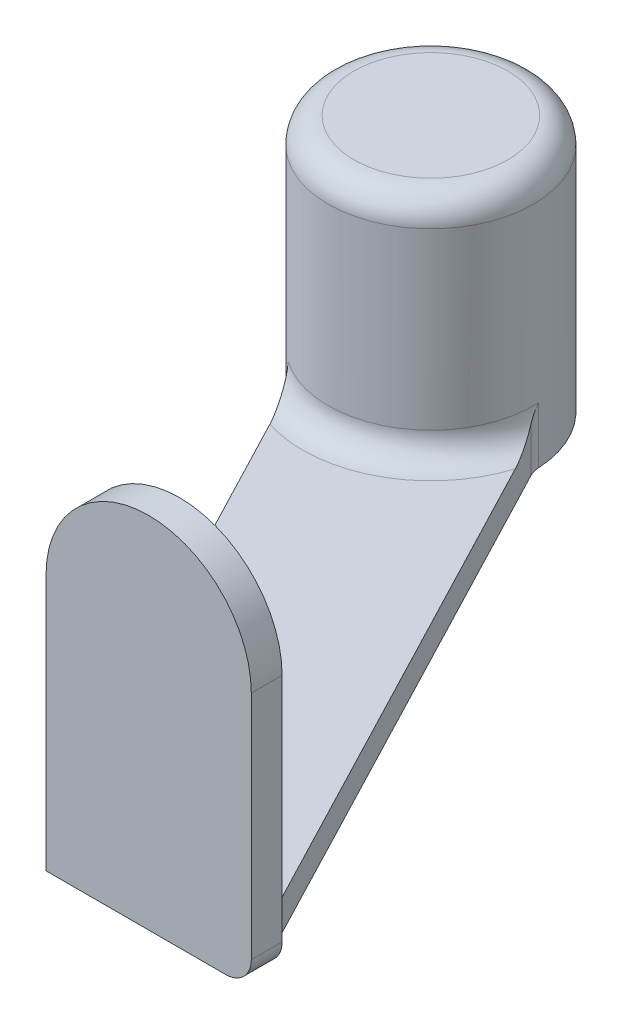
ISO-10303-21;
HEADER;
FILE_DESCRIPTION(('STEP AP214'),'2;1');
FILE_NAME('part.step','',(''),(''),'','','');
FILE_SCHEMA(('AUTOMOTIVE_DESIGN { 1 0 10303 214 1 1 1 1 }'));
ENDSEC;
DATA;
#1=APPLICATION_CONTEXT('core data for automotive mechanical design processes');
#2=APPLICATION_PROTOCOL_DEFINITION('international standard','automotive_design',2000,#1);
#3=PRODUCT_CONTEXT('',#1,'mechanical');
#4=PRODUCT('Part','Part','',(#3));
#5=PRODUCT_RELATED_PRODUCT_CATEGORY('part','',(#4));
#6=PRODUCT_DEFINITION_FORMATION('','',#4);
#7=PRODUCT_DEFINITION_CONTEXT('part definition',#1,'design');
#8=PRODUCT_DEFINITION('design','',#6,#7);
#9=PRODUCT_DEFINITION_SHAPE('','',#8);
#10=(LENGTH_UNIT() NAMED_UNIT(*) SI_UNIT(.MILLI.,.METRE.));
#11=(NAMED_UNIT(*) PLANE_ANGLE_UNIT() SI_UNIT($,.RADIAN.));
#12=(NAMED_UNIT(*) SI_UNIT($,.STERADIAN.) SOLID_ANGLE_UNIT());
#13=UNCERTAINTY_MEASURE_WITH_UNIT(LENGTH_MEASURE(1.E-05),#10,'distance_accuracy_value','');
#14=(GEOMETRIC_REPRESENTATION_CONTEXT(3) GLOBAL_UNCERTAINTY_ASSIGNED_CONTEXT((#13)) GLOBAL_UNIT_ASSIGNED_CONTEXT((#10,
#11,#12)) REPRESENTATION_CONTEXT('',''));
#15=CARTESIAN_POINT('',(0.,0.,0.));
#16=DIRECTION('',(0.,0.,1.));
#17=DIRECTION('',(1.,0.,0.));
#18=AXIS2_PLACEMENT_3D('',#15,#16,#17);
#19=CARTESIAN_POINT('',(459.323706874525,0.,110.));
#20=DIRECTION('',(0.,-1.,0.));
#21=DIRECTION('',(0.,0.,-1.));
#22=AXIS2_PLACEMENT_3D('',#19,#20,#21);
#23=PLANE('',#22);
#24=CARTESIAN_POINT('',(-59.9999999999999,0.,0.));
#25=DIRECTION('',(0.,-1.,0.));
#26=DIRECTION('',(0.,0.,-1.));
#27=AXIS2_PLACEMENT_3D('',#24,#25,#26);
#28=CIRCLE('',#27,15.);
#29=CARTESIAN_POINT('',(-59.9999999999999,0.,-15.));
#30=VERTEX_POINT('',#29);
#31=EDGE_CURVE('E187',#30,#30,#28,.F.);
#32=ORIENTED_EDGE('',*,*,#31,.T.);
#33=EDGE_LOOP('',(#32));
#34=FACE_BOUND('',#33,.T.);
#35=ADVANCED_FACE('F37',(#34),#23,.F.);
#36=CARTESIAN_POINT('',(-59.9999999999999,-5.,0.));
#37=DIRECTION('',(0.,-1.,0.));
#38=DIRECTION('',(0.,0.,-1.));
#39=AXIS2_PLACEMENT_3D('',#36,#37,#38);
#40=TOROIDAL_SURFACE('',#39,15.,5.);
#41=ORIENTED_EDGE('',*,*,#31,.F.);
#42=EDGE_LOOP('',(#41));
#43=FACE_BOUND('',#42,.T.);
#44=CARTESIAN_POINT('',(-59.9999999999999,-5.,0.));
#45=DIRECTION('',(0.,-1.,0.));
#46=DIRECTION('',(0.,0.,-1.));
#47=AXIS2_PLACEMENT_3D('',#44,#45,#46);
#48=CIRCLE('',#47,20.);
#49=CARTESIAN_POINT('',(-59.9999999999999,-5.,-20.));
#50=VERTEX_POINT('',#49);
#51=EDGE_CURVE('E184',#50,#50,#48,.T.);
#52=ORIENTED_EDGE('',*,*,#51,.F.);
#53=EDGE_LOOP('',(#52));
#54=FACE_BOUND('',#53,.T.);
#55=ADVANCED_FACE('F244',(#43,#54),#40,.T.);
#56=CARTESIAN_POINT('',(-35.0332908701864,56.5685424949237,-1.28974231041803));
#57=DIRECTION('',(0.,-1.,0.));
#58=DIRECTION('',(0.,0.,-1.));
#59=AXIS2_PLACEMENT_3D('',#56,#57,#58);
#60=CYLINDRICAL_SURFACE('',#59,5.);
#61=CARTESIAN_POINT('',(-35.0332908701864,-50.,-1.28974231041803));
#62=DIRECTION('',(0.,-1.,0.));
#63=DIRECTION('',(0.,0.,-1.));
#64=AXIS2_PLACEMENT_3D('',#61,#62,#63);
#65=CIRCLE('',#64,5.);
#66=CARTESIAN_POINT('',(-40.0266326961491,-50.,-1.03179384833445));
#67=VERTEX_POINT('',#66);
#68=CARTESIAN_POINT('',(-39.4662151010136,-50.,1.02308772305709));
#69=VERTEX_POINT('',#68);
#70=EDGE_CURVE('E11',#67,#69,#65,.F.);
#71=ORIENTED_EDGE('',*,*,#70,.F.);
#72=DIRECTION('',(0.,-1.,0.));
#73=VECTOR('',#72,1.);
#74=CARTESIAN_POINT('',(-40.0266326961491,56.5685424949237,-1.03179384833445));
#75=LINE('',#74,#73);
#76=CARTESIAN_POINT('',(-40.0266326961491,-39.,-1.03179384833445));
#77=VERTEX_POINT('',#76);
#78=EDGE_CURVE('E179',#77,#67,#75,.T.);
#79=ORIENTED_EDGE('',*,*,#78,.F.);
#80=CARTESIAN_POINT('',(-39.4662151010136,-41.2977810602773,1.02308772305708));
#81=CARTESIAN_POINT('',(-39.5095887979578,-41.2060498439024,0.939940789862016));
#82=CARTESIAN_POINT('',(-39.5502483735114,-41.1134994802737,0.856321294083508));
#83=CARTESIAN_POINT('',(-39.6263249326898,-40.927014083348,0.688276245564753));
#84=CARTESIAN_POINT('',(-39.6617427752191,-40.8330792796837,0.603850827300817));
#85=CARTESIAN_POINT('',(-39.7604166635182,-40.549577123353,0.349572690890365));
#86=CARTESIAN_POINT('',(-39.8161131697166,-40.358268911895,0.178679097171923));
#87=CARTESIAN_POINT('',(-39.9079112911607,-39.9748426216244,-0.163206415626178));
#88=CARTESIAN_POINT('',(-39.9442094631328,-39.7827533449341,-0.33417906644567));
#89=CARTESIAN_POINT('',(-39.9986951654497,-39.3972707643113,-0.677426022940305));
#90=CARTESIAN_POINT('',(-40.01689082866,-39.2038780853071,-0.849699709019501));
#91=CARTESIAN_POINT('',(-40.0263054720988,-39.0070272630662,-1.02551699609125));
#92=CARTESIAN_POINT('',(-40.0264705617197,-39.003513620113,-1.02865535611878));
#93=CARTESIAN_POINT('',(-40.0266326961491,-39.,-1.03179384833445));
#94=B_SPLINE_CURVE_WITH_KNOTS('',3,(#80,#81,#82,#83,#84,#85,#86,#87,#88,#89,#90,#91,#92,#93),
.UNSPECIFIED.,.F.,.F.,(4,2,2,2,2,2,4),(0.,0.393477765699106,0.786890985021735,1.57353344680757,
2.3520462745288,3.13020918372411,3.14435132214104),.UNSPECIFIED.);
#95=CARTESIAN_POINT('',(-39.4662151010136,-41.2977810602773,1.02308772305708));
#96=VERTEX_POINT('',#95);
#97=EDGE_CURVE('E41',#96,#77,#94,.T.);
#98=ORIENTED_EDGE('',*,*,#97,.F.);
#99=DIRECTION('',(0.,-1.,0.));
#100=VECTOR('',#99,1.);
#101=CARTESIAN_POINT('',(-39.4662151010136,-44.,1.02308772305708));
#102=LINE('',#101,#100);
#103=EDGE_CURVE('E57',#69,#96,#102,.F.);
#104=ORIENTED_EDGE('',*,*,#103,.F.);
#105=EDGE_LOOP('',(#71,#79,#98,#104));
#106=FACE_BOUND('',#105,.T.);
#107=ADVANCED_FACE('F246',(#106),#60,.F.);
#108=CARTESIAN_POINT('',(-59.9999999999999,56.5685424949237,0.));
#109=DIRECTION('',(0.,-1.,0.));
#110=DIRECTION('',(0.,0.,-1.));
#111=AXIS2_PLACEMENT_3D('',#108,#109,#110);
#112=CYLINDRICAL_SURFACE('',#111,20.);
#113=ORIENTED_EDGE('',*,*,#51,.T.);
#114=EDGE_LOOP('',(#113));
#115=FACE_BOUND('',#114,.T.);
#116=DIRECTION('',(0.,-1.,0.));
#117=VECTOR('',#116,1.);
#118=CARTESIAN_POINT('',(-71.4413075780089,56.5685424949237,16.4041604754828));
#119=LINE('',#118,#117);
#120=CARTESIAN_POINT('',(-71.4413075780089,-39.,16.4041604754827));
#121=VERTEX_POINT('',#120);
#122=CARTESIAN_POINT('',(-71.4413075780089,-50.,16.4041604754827));
#123=VERTEX_POINT('',#122);
#124=EDGE_CURVE('E263',#121,#123,#119,.T.);
#125=ORIENTED_EDGE('',*,*,#124,.F.);
#126=CARTESIAN_POINT('',(-59.9999999999999,-39.,0.));
#127=DIRECTION('',(0.,-1.,0.));
#128=DIRECTION('',(0.,0.,-1.));
#129=AXIS2_PLACEMENT_3D('',#126,#127,#128);
#130=CIRCLE('',#129,20.);
#131=EDGE_CURVE('E181',#121,#77,#130,.F.);
#132=ORIENTED_EDGE('',*,*,#131,.T.);
#133=ORIENTED_EDGE('',*,*,#78,.T.);
#134=CARTESIAN_POINT('',(-59.9999999999999,-50.,0.));
#135=DIRECTION('',(0.,-1.,0.));
#136=DIRECTION('',(0.,0.,-1.));
#137=AXIS2_PLACEMENT_3D('',#134,#135,#136);
#138=CIRCLE('',#137,20.);
#139=EDGE_CURVE('E266',#67,#123,#138,.F.);
#140=ORIENTED_EDGE('',*,*,#139,.T.);
#141=EDGE_LOOP('',(#125,#132,#133,#140));
#142=FACE_BOUND('',#141,.T.);
#143=ADVANCED_FACE('F252',(#115,#142),#112,.T.);
#144=CARTESIAN_POINT('',(-59.9999999999999,-39.,0.));
#145=DIRECTION('',(0.,-1.,0.));
#146=DIRECTION('',(0.,0.,-1.));
#147=AXIS2_PLACEMENT_3D('',#144,#145,#146);
#148=TOROIDAL_SURFACE('',#147,25.,5.);
#149=CARTESIAN_POINT('',(-67.5686326367219,-44.,23.8267874462828));
#150=CARTESIAN_POINT('',(-67.6394074778955,-43.9999957063343,23.6911356673668));
#151=CARTESIAN_POINT('',(-67.7101693269902,-43.9965102357067,23.5555087899353));
#152=CARTESIAN_POINT('',(-67.8515436503336,-43.982824454178,23.2845413368606));
#153=CARTESIAN_POINT('',(-67.9221561462281,-43.9726251943338,23.1492007197293));
#154=CARTESIAN_POINT('',(-68.1335256147483,-43.9323437636526,22.7440759050655));
#155=CARTESIAN_POINT('',(-68.2739074317342,-43.8925772846245,22.4750107558426));
#156=CARTESIAN_POINT('',(-68.5553106455663,-43.7879210311718,21.9356545959978));
#157=CARTESIAN_POINT('',(-68.6962953245598,-43.7225774758398,21.6654339612603));
#158=CARTESIAN_POINT('',(-68.9754564169969,-43.5680930803219,21.1303752007558));
#159=CARTESIAN_POINT('',(-69.1136326375733,-43.4789506116786,20.8655374446511));
#160=CARTESIAN_POINT('',(-69.389230371853,-43.2754307265991,20.3373084539483));
#161=CARTESIAN_POINT('',(-69.5265734537269,-43.1605573238025,20.0740675470233));
#162=CARTESIAN_POINT('',(-69.7965368251537,-42.9065511518861,19.5566377517886));
#163=CARTESIAN_POINT('',(-69.929153860611,-42.7674020421872,19.3024551004956));
#164=CARTESIAN_POINT('',(-70.1227614742166,-42.5402533569809,18.9313738410847));
#165=CARTESIAN_POINT('',(-70.1861743848697,-42.4618069485181,18.8098324289996));
#166=CARTESIAN_POINT('',(-70.3111591379351,-42.2983539201054,18.5702783189576));
#167=CARTESIAN_POINT('',(-70.3727313375051,-42.2133485844145,18.4522649364484));
#168=CARTESIAN_POINT('',(-70.493610904877,-42.0364882798731,18.2205790989857));
#169=CARTESIAN_POINT('',(-70.5529213890247,-41.9446432918659,18.1069006710358));
#170=CARTESIAN_POINT('',(-70.6688845897273,-41.7534689176981,17.8846378696892));
#171=CARTESIAN_POINT('',(-70.7255383875241,-41.6541426200054,17.7760514239121));
#172=CARTESIAN_POINT('',(-70.815884657388,-41.4842387426586,17.6028877400062));
#173=CARTESIAN_POINT('',(-70.8505469487247,-41.4160735492951,17.5364516816109));
#174=CARTESIAN_POINT('',(-70.9182607645014,-41.2761394628668,17.4066668680389));
#175=CARTESIAN_POINT('',(-70.9513124312852,-41.2043708894038,17.3433178400366));
#176=CARTESIAN_POINT('',(-71.0477904315063,-40.9829344105169,17.1584016729462));
#177=CARTESIAN_POINT('',(-71.1084315459832,-40.8273346582699,17.0421728701987));
#178=CARTESIAN_POINT('',(-71.1916243947202,-40.579659173285,16.8827199101195));
#179=CARTESIAN_POINT('',(-71.2182517164447,-40.4939338923417,16.8316842101474));
#180=CARTESIAN_POINT('',(-71.2680608050631,-40.3178447272519,16.7362167902956));
#181=CARTESIAN_POINT('',(-71.2912418712319,-40.2274799047617,16.6917864134721));
#182=CARTESIAN_POINT('',(-71.3332944971637,-40.0427996459699,16.6111855471027));
#183=CARTESIAN_POINT('',(-71.3521907413328,-39.9485107450309,16.5749677457786));
#184=CARTESIAN_POINT('',(-71.3850434119212,-39.7560545471287,16.512000127151));
#185=CARTESIAN_POINT('',(-71.3990050377481,-39.657891454252,16.4852403443161));
#186=CARTESIAN_POINT('',(-71.4203066358278,-39.4671819630536,16.44441228133));
#187=CARTESIAN_POINT('',(-71.4281149729534,-39.3748843533696,16.4294463018391));
#188=CARTESIAN_POINT('',(-71.4359954991483,-39.2351853626568,16.4143419599656));
#189=CARTESIAN_POINT('',(-71.4379838272847,-39.1882630761937,16.4105309977042));
#190=CARTESIAN_POINT('',(-71.4406411161503,-39.0942310759437,16.4054378607118));
#191=CARTESIAN_POINT('',(-71.4413096982431,-39.0471213122526,16.4041564117005));
#192=CARTESIAN_POINT('',(-71.4413075780089,-39.,16.4041604754827));
#193=B_SPLINE_CURVE_WITH_KNOTS('',3,(#149,#150,#151,#152,#153,#154,#155,#156,#157,#158,#159,
#160,#161,#162,#163,#164,#165,#166,#167,#168,#169,#170,#171,#172,#173,#174,#175,#176,#177,#178,
#179,#180,#181,#182,#183,#184,#185,#186,#187,#188,#189,#190,#191,#192),.UNSPECIFIED.,.F.,.F.,(4,
2,2,2,2,2,2,2,2,2,2,2,2,2,2,2,2,2,2,2,2,4),(0.,0.45892521038416,0.917778592209801,
1.83488510432387,2.7690593095204,3.70329745263651,4.65738803065461,5.61212332618994,
6.08581743172794,6.55941902067393,7.03234255539925,7.50507191463021,7.80885051623837,
8.11260222162986,8.72102310469405,9.03051451975441,9.3400687777034,9.64779166037518,
9.95518933446293,10.2359930014452,10.3772721398365,10.5185918054554),.UNSPECIFIED.);
#194=CARTESIAN_POINT('',(-67.568632636722,-44.,23.8267874462828));
#195=VERTEX_POINT('',#194);
#196=EDGE_CURVE('E204',#195,#121,#193,.T.);
#197=ORIENTED_EDGE('',*,*,#196,.F.);
#198=CARTESIAN_POINT('',(-59.9999999999999,-44.,0.));
#199=DIRECTION('',(0.,-1.,0.));
#200=DIRECTION('',(0.,0.,-1.));
#201=AXIS2_PLACEMENT_3D('',#198,#199,#200);
#202=CIRCLE('',#201,25.);
#203=CARTESIAN_POINT('',(-36.127325058713,-44.,7.42262697079996));
#204=VERTEX_POINT('',#203);
#205=EDGE_CURVE('E192',#204,#195,#202,.T.);
#206=ORIENTED_EDGE('',*,*,#205,.F.);
#207=CARTESIAN_POINT('',(-39.4662151010136,-41.2977810602773,1.02308772305708));
#208=CARTESIAN_POINT('',(-39.4310801206479,-41.372047631136,1.09042976875813));
#209=CARTESIAN_POINT('',(-39.3950520785148,-41.4442990005166,1.15948351617978));
#210=CARTESIAN_POINT('',(-39.321460439985,-41.5849808420244,1.30053415669527));
#211=CARTESIAN_POINT('',(-39.2838975497158,-41.653413037682,1.37252969637799));
#212=CARTESIAN_POINT('',(-39.2075308884322,-41.7865997555289,1.51889913050492));
#213=CARTESIAN_POINT('',(-39.1687297515882,-41.8513613646148,1.59326797612248));
#214=CARTESIAN_POINT('',(-39.0899820663682,-41.977555076726,1.74420103946081));
#215=CARTESIAN_POINT('',(-39.0500353645158,-42.0389867304058,1.82076555134465));
#216=CARTESIAN_POINT('',(-38.9287171024863,-42.2185094382373,2.05329222023455));
#217=CARTESIAN_POINT('',(-38.845839620667,-42.331876026524,2.21214072705488));
#218=CARTESIAN_POINT('',(-38.6768732319592,-42.5470105977814,2.53599297207815));
#219=CARTESIAN_POINT('',(-38.5907818850232,-42.6487695200325,2.70100138703878));
#220=CARTESIAN_POINT('',(-38.3684602004422,-42.8935800018219,3.1271179491523));
#221=CARTESIAN_POINT('',(-38.2304192447908,-43.029000623418,3.39169644748425));
#222=CARTESIAN_POINT('',(-37.9495801235375,-43.2744207909353,3.92997142988627));
#223=CARTESIAN_POINT('',(-37.8067806959316,-43.3844135306858,4.20367033279759));
#224=CARTESIAN_POINT('',(-37.5173686973729,-43.5787682633448,4.75837666336856));
#225=CARTESIAN_POINT('',(-37.3707531810977,-43.6631097805981,5.03938973622928));
#226=CARTESIAN_POINT('',(-37.0748398287865,-43.8049111534692,5.60655699482584));
#227=CARTESIAN_POINT('',(-36.9255437302597,-43.8623878125707,5.89270785033543));
#228=CARTESIAN_POINT('',(-36.6678092438755,-43.9365322706474,6.38669894923848));
#229=CARTESIAN_POINT('',(-36.5597933475178,-43.9601510504176,6.5937294172575));
#230=CARTESIAN_POINT('',(-36.343637933063,-43.9918477988025,7.00802729496247));
#231=CARTESIAN_POINT('',(-36.2355000074283,-43.9999769458228,7.21529165242901));
#232=CARTESIAN_POINT('',(-36.127325058713,-44.,7.42262697079997));
#233=B_SPLINE_CURVE_WITH_KNOTS('',3,(#207,#208,#209,#210,#211,#212,#213,#214,#215,#216,#217,
#218,#219,#220,#221,#222,#223,#224,#225,#226,#227,#228,#229,#230,#231,#232),.UNSPECIFIED.,.F.,
.F.,(4,2,2,2,2,2,2,2,2,2,2,2,4),(0.,0.318613584331943,0.637082201181584,0.954913386935928,
1.27278735471746,1.90830568841895,2.54431674906335,3.52613455500781,4.50821485637313,
5.49107704160758,6.47332363888856,7.17696009410413,7.87826764573218),.UNSPECIFIED.);
#234=EDGE_CURVE('E198',#96,#204,#233,.T.);
#235=ORIENTED_EDGE('',*,*,#234,.F.);
#236=ORIENTED_EDGE('',*,*,#97,.T.);
#237=ORIENTED_EDGE('',*,*,#131,.F.);
#238=EDGE_LOOP('',(#197,#206,#235,#236,#237));
#239=FACE_BOUND('',#238,.T.);
#240=ADVANCED_FACE('F210',(#239),#148,.F.);
#241=CARTESIAN_POINT('',(459.323706874525,-44.,110.));
#242=DIRECTION('',(0.,-1.,0.));
#243=DIRECTION('',(0.,0.,-1.));
#244=AXIS2_PLACEMENT_3D('',#241,#242,#243);
#245=PLANE('',#244);
#246=DIRECTION('',(0.46256600669502,0.,0.886584846165455));
#247=VECTOR('',#246,1.);
#248=CARTESIAN_POINT('',(-40.,-44.,0.));
#249=LINE('',#248,#247);
#250=CARTESIAN_POINT('',(14.2608695652174,-44.,104.));
#251=VERTEX_POINT('',#250);
#252=EDGE_CURVE('E283',#204,#251,#249,.T.);
#253=ORIENTED_EDGE('',*,*,#252,.F.);
#254=ORIENTED_EDGE('',*,*,#205,.T.);
#255=DIRECTION('',(-0.46256600669502,0.,-0.886584846165455));
#256=VECTOR('',#255,1.);
#257=CARTESIAN_POINT('',(-20.,-44.,115.));
#258=LINE('',#257,#256);
#259=CARTESIAN_POINT('',(-20.,-44.,115.));
#260=VERTEX_POINT('',#259);
#261=EDGE_CURVE('E274',#260,#195,#258,.T.);
#262=ORIENTED_EDGE('',*,*,#261,.F.);
#263=DIRECTION('',(0.,0.,-1.));
#264=VECTOR('',#263,1.);
#265=CARTESIAN_POINT('',(-20.,-44.,115.));
#266=LINE('',#265,#264);
#267=CARTESIAN_POINT('',(-20.,-44.,104.));
#268=VERTEX_POINT('',#267);
#269=EDGE_CURVE('E148',#260,#268,#266,.T.);
#270=ORIENTED_EDGE('',*,*,#269,.T.);
#271=DIRECTION('',(-1.,0.,0.));
#272=VECTOR('',#271,1.);
#273=CARTESIAN_POINT('',(459.323706874525,-44.,104.));
#274=LINE('',#273,#272);
#275=EDGE_CURVE('E190',#268,#251,#274,.F.);
#276=ORIENTED_EDGE('',*,*,#275,.T.);
#277=EDGE_LOOP('',(#253,#254,#262,#270,#276));
#278=FACE_BOUND('',#277,.T.);
#279=ADVANCED_FACE('F218',(#278),#245,.F.);
#280=CARTESIAN_POINT('',(0.,-39.,104.));
#281=DIRECTION('',(-1.,0.,0.));
#282=DIRECTION('',(0.,0.,1.));
#283=AXIS2_PLACEMENT_3D('',#280,#281,#282);
#284=CYLINDRICAL_SURFACE('',#283,5.);
#285=CARTESIAN_POINT('',(14.2608695652174,-39.,104.));
#286=DIRECTION('',(0.886584846165455,0.,-0.46256600669502));
#287=DIRECTION('',(-0.46256600669502,0.,-0.886584846165455));
#288=AXIS2_PLACEMENT_3D('',#285,#286,#287);
#289=ELLIPSE('',#288,5.63961816133602,5.);
#290=CARTESIAN_POINT('',(16.8695652173913,-39.,109.));
#291=VERTEX_POINT('',#290);
#292=EDGE_CURVE('E50',#251,#291,#289,.F.);
#293=ORIENTED_EDGE('',*,*,#292,.F.);
#294=ORIENTED_EDGE('',*,*,#275,.F.);
#295=CARTESIAN_POINT('',(-20.,-39.,104.));
#296=DIRECTION('',(1.,0.,0.));
#297=DIRECTION('',(0.,0.,-1.));
#298=AXIS2_PLACEMENT_3D('',#295,#296,#297);
#299=CIRCLE('',#298,5.);
#300=CARTESIAN_POINT('',(-20.,-39.,109.));
#301=VERTEX_POINT('',#300);
#302=EDGE_CURVE('E277',#301,#268,#299,.T.);
#303=ORIENTED_EDGE('',*,*,#302,.F.);
#304=DIRECTION('',(-1.,0.,0.));
#305=VECTOR('',#304,1.);
#306=CARTESIAN_POINT('',(0.,-39.,109.));
#307=LINE('',#306,#305);
#308=EDGE_CURVE('E194',#291,#301,#307,.T.);
#309=ORIENTED_EDGE('',*,*,#308,.F.);
#310=EDGE_LOOP('',(#293,#294,#303,#309));
#311=FACE_BOUND('',#310,.T.);
#312=ADVANCED_FACE('F39',(#311),#284,.F.);
#313=CARTESIAN_POINT('',(-40.,-44.,0.));
#314=DIRECTION('',(0.886584846165455,0.,-0.46256600669502));
#315=DIRECTION('',(-0.46256600669502,0.,-0.886584846165455));
#316=AXIS2_PLACEMENT_3D('',#313,#314,#315);
#317=PLANE('',#316);
#318=DIRECTION('',(0.46256600669502,0.,0.886584846165455));
#319=VECTOR('',#318,1.);
#320=CARTESIAN_POINT('',(-40.,-50.,0.));
#321=LINE('',#320,#319);
#322=CARTESIAN_POINT('',(15.,-50.,105.416666666667));
#323=VERTEX_POINT('',#322);
#324=EDGE_CURVE('E284',#69,#323,#321,.T.);
#325=ORIENTED_EDGE('',*,*,#324,.F.);
#326=ORIENTED_EDGE('',*,*,#103,.T.);
#327=ORIENTED_EDGE('',*,*,#234,.T.);
#328=ORIENTED_EDGE('',*,*,#252,.T.);
#329=ORIENTED_EDGE('',*,*,#292,.T.);
#330=DIRECTION('',(0.,-1.,0.));
#331=VECTOR('',#330,1.);
#332=CARTESIAN_POINT('',(16.8695652173913,0.,109.));
#333=LINE('',#332,#331);
#334=CARTESIAN_POINT('',(16.8695652173913,-49.6373188264255,109.));
#335=VERTEX_POINT('',#334);
#336=EDGE_CURVE('E158',#291,#335,#333,.T.);
#337=ORIENTED_EDGE('',*,*,#336,.T.);
#338=CARTESIAN_POINT('',(15.,-45.,105.416666666667));
#339=DIRECTION('',(0.886584846165455,0.,-0.46256600669502));
#340=DIRECTION('',(-0.46256600669502,0.,-0.886584846165455));
#341=AXIS2_PLACEMENT_3D('',#338,#339,#340);
#342=ELLIPSE('',#341,10.8092681425607,5.);
#343=EDGE_CURVE('E176',#335,#323,#342,.T.);
#344=ORIENTED_EDGE('',*,*,#343,.T.);
#345=EDGE_LOOP('',(#325,#326,#327,#328,#329,#337,#344));
#346=FACE_BOUND('',#345,.T.);
#347=ADVANCED_FACE('F213',(#346),#317,.T.);
#348=CARTESIAN_POINT('',(15.,-45.,110.));
#349=DIRECTION('',(0.,0.,-1.));
#350=DIRECTION('',(-1.,0.,0.));
#351=AXIS2_PLACEMENT_3D('',#348,#349,#350);
#352=CYLINDRICAL_SURFACE('',#351,5.);
#353=CARTESIAN_POINT('',(15.,-45.,109.));
#354=DIRECTION('',(0.,0.,-1.));
#355=DIRECTION('',(-1.,0.,0.));
#356=AXIS2_PLACEMENT_3D('',#353,#354,#355);
#357=CIRCLE('',#356,5.);
#358=CARTESIAN_POINT('',(20.,-45.,109.));
#359=VERTEX_POINT('',#358);
#360=EDGE_CURVE('E174',#359,#335,#357,.T.);
#361=ORIENTED_EDGE('',*,*,#360,.F.);
#362=DIRECTION('',(0.,0.,1.));
#363=VECTOR('',#362,1.);
#364=CARTESIAN_POINT('',(20.,-45.,109.));
#365=LINE('',#364,#363);
#366=CARTESIAN_POINT('',(20.,-45.,115.));
#367=VERTEX_POINT('',#366);
#368=EDGE_CURVE('E172',#367,#359,#365,.F.);
#369=ORIENTED_EDGE('',*,*,#368,.F.);
#370=CARTESIAN_POINT('',(15.,-45.,115.));
#371=DIRECTION('',(0.,0.,-1.));
#372=DIRECTION('',(-1.,0.,0.));
#373=AXIS2_PLACEMENT_3D('',#370,#371,#372);
#374=CIRCLE('',#373,5.);
#375=CARTESIAN_POINT('',(15.,-50.,115.));
#376=VERTEX_POINT('',#375);
#377=EDGE_CURVE('E170',#376,#367,#374,.F.);
#378=ORIENTED_EDGE('',*,*,#377,.F.);
#379=DIRECTION('',(0.,0.,1.));
#380=VECTOR('',#379,1.);
#381=CARTESIAN_POINT('',(15.,-50.,115.));
#382=LINE('',#381,#380);
#383=EDGE_CURVE('E166',#323,#376,#382,.T.);
#384=ORIENTED_EDGE('',*,*,#383,.F.);
#385=ORIENTED_EDGE('',*,*,#343,.F.);
#386=EDGE_LOOP('',(#361,#369,#378,#384,#385));
#387=FACE_BOUND('',#386,.T.);
#388=ADVANCED_FACE('F217',(#387),#352,.T.);
#389=CARTESIAN_POINT('',(459.323706874525,-50.,110.));
#390=DIRECTION('',(0.,-1.,0.));
#391=DIRECTION('',(0.,0.,-1.));
#392=AXIS2_PLACEMENT_3D('',#389,#390,#391);
#393=PLANE('',#392);
#394=ORIENTED_EDGE('',*,*,#139,.F.);
#395=ORIENTED_EDGE('',*,*,#70,.T.);
#396=ORIENTED_EDGE('',*,*,#324,.T.);
#397=ORIENTED_EDGE('',*,*,#383,.T.);
#398=DIRECTION('',(-1.,0.,0.));
#399=VECTOR('',#398,1.);
#400=CARTESIAN_POINT('',(-20.,-50.,115.));
#401=LINE('',#400,#399);
#402=CARTESIAN_POINT('',(-20.,-50.,115.));
#403=VERTEX_POINT('',#402);
#404=EDGE_CURVE('E150',#376,#403,#401,.T.);
#405=ORIENTED_EDGE('',*,*,#404,.T.);
#406=DIRECTION('',(-0.46256600669502,0.,-0.886584846165455));
#407=VECTOR('',#406,1.);
#408=CARTESIAN_POINT('',(-20.,-50.,115.));
#409=LINE('',#408,#407);
#410=EDGE_CURVE('E269',#403,#123,#409,.T.);
#411=ORIENTED_EDGE('',*,*,#410,.T.);
#412=EDGE_LOOP('',(#394,#395,#396,#397,#405,#411));
#413=FACE_BOUND('',#412,.T.);
#414=ADVANCED_FACE('F224',(#413),#393,.T.);
#415=CARTESIAN_POINT('',(-20.,-44.,115.));
#416=DIRECTION('',(-0.886584846165455,0.,0.462566006695019));
#417=DIRECTION('',(0.46256600669502,0.,0.886584846165455));
#418=AXIS2_PLACEMENT_3D('',#415,#416,#417);
#419=PLANE('',#418);
#420=ORIENTED_EDGE('',*,*,#261,.T.);
#421=ORIENTED_EDGE('',*,*,#196,.T.);
#422=ORIENTED_EDGE('',*,*,#124,.T.);
#423=ORIENTED_EDGE('',*,*,#410,.F.);
#424=DIRECTION('',(0.,1.,0.));
#425=VECTOR('',#424,1.);
#426=CARTESIAN_POINT('',(-20.,-50.,115.));
#427=LINE('',#426,#425);
#428=EDGE_CURVE('E149',#403,#260,#427,.T.);
#429=ORIENTED_EDGE('',*,*,#428,.T.);
#430=EDGE_LOOP('',(#420,#421,#422,#423,#429));
#431=FACE_BOUND('',#430,.T.);
#432=ADVANCED_FACE('F220',(#431),#419,.T.);
#433=CARTESIAN_POINT('',(-20.,-50.,115.));
#434=DIRECTION('',(1.,0.,0.));
#435=DIRECTION('',(0.,0.,-1.));
#436=AXIS2_PLACEMENT_3D('',#433,#434,#435);
#437=PLANE('',#436);
#438=ORIENTED_EDGE('',*,*,#269,.F.);
#439=CARTESIAN_POINT('',(-20.,0.,115.));
#440=VERTEX_POINT('',#439);
#441=EDGE_CURVE('E131',#260,#440,#427,.T.);
#442=ORIENTED_EDGE('',*,*,#441,.T.);
#443=DIRECTION('',(0.,0.,-1.));
#444=VECTOR('',#443,1.);
#445=CARTESIAN_POINT('',(-20.,0.,115.));
#446=LINE('',#445,#444);
#447=CARTESIAN_POINT('',(-20.,0.,109.));
#448=VERTEX_POINT('',#447);
#449=EDGE_CURVE('E146',#440,#448,#446,.T.);
#450=ORIENTED_EDGE('',*,*,#449,.T.);
#451=DIRECTION('',(0.,1.,0.));
#452=VECTOR('',#451,1.);
#453=CARTESIAN_POINT('',(-20.,-50.,109.));
#454=LINE('',#453,#452);
#455=EDGE_CURVE('E139',#301,#448,#454,.T.);
#456=ORIENTED_EDGE('',*,*,#455,.F.);
#457=ORIENTED_EDGE('',*,*,#302,.T.);
#458=EDGE_LOOP('',(#438,#442,#450,#456,#457));
#459=FACE_BOUND('',#458,.T.);
#460=ADVANCED_FACE('F144',(#459),#437,.F.);
#461=CARTESIAN_POINT('',(0.,0.,109.));
#462=DIRECTION('',(0.,0.,-1.));
#463=DIRECTION('',(-1.,0.,0.));
#464=AXIS2_PLACEMENT_3D('',#461,#462,#463);
#465=PLANE('',#464);
#466=ORIENTED_EDGE('',*,*,#336,.F.);
#467=ORIENTED_EDGE('',*,*,#308,.T.);
#468=ORIENTED_EDGE('',*,*,#455,.T.);
#469=CARTESIAN_POINT('',(0.,0.,109.));
#470=DIRECTION('',(0.,0.,-1.));
#471=DIRECTION('',(-1.,0.,0.));
#472=AXIS2_PLACEMENT_3D('',#469,#470,#471);
#473=CIRCLE('',#472,20.);
#474=CARTESIAN_POINT('',(20.,0.,109.));
#475=VERTEX_POINT('',#474);
#476=EDGE_CURVE('E138',#448,#475,#473,.T.);
#477=ORIENTED_EDGE('',*,*,#476,.T.);
#478=DIRECTION('',(0.,1.,0.));
#479=VECTOR('',#478,1.);
#480=CARTESIAN_POINT('',(20.,-50.,109.));
#481=LINE('',#480,#479);
#482=EDGE_CURVE('E163',#359,#475,#481,.T.);
#483=ORIENTED_EDGE('',*,*,#482,.F.);
#484=ORIENTED_EDGE('',*,*,#360,.T.);
#485=EDGE_LOOP('',(#466,#467,#468,#477,#483,#484));
#486=FACE_BOUND('',#485,.T.);
#487=ADVANCED_FACE('F234',(#486),#465,.T.);
#488=CARTESIAN_POINT('',(0.,0.,115.));
#489=DIRECTION('',(0.,0.,-1.));
#490=DIRECTION('',(-1.,0.,0.));
#491=AXIS2_PLACEMENT_3D('',#488,#489,#490);
#492=PLANE('',#491);
#493=DIRECTION('',(0.,1.,0.));
#494=VECTOR('',#493,1.);
#495=CARTESIAN_POINT('',(20.,-50.,115.));
#496=LINE('',#495,#494);
#497=CARTESIAN_POINT('',(20.,0.,115.));
#498=VERTEX_POINT('',#497);
#499=EDGE_CURVE('E133',#367,#498,#496,.T.);
#500=ORIENTED_EDGE('',*,*,#499,.T.);
#501=CARTESIAN_POINT('',(0.,0.,115.));
#502=DIRECTION('',(0.,0.,-1.));
#503=DIRECTION('',(-1.,0.,0.));
#504=AXIS2_PLACEMENT_3D('',#501,#502,#503);
#505=CIRCLE('',#504,20.);
#506=EDGE_CURVE('E127',#440,#498,#505,.T.);
#507=ORIENTED_EDGE('',*,*,#506,.F.);
#508=ORIENTED_EDGE('',*,*,#441,.F.);
#509=ORIENTED_EDGE('',*,*,#428,.F.);
#510=ORIENTED_EDGE('',*,*,#404,.F.);
#511=ORIENTED_EDGE('',*,*,#377,.T.);
#512=EDGE_LOOP('',(#500,#507,#508,#509,#510,#511));
#513=FACE_BOUND('',#512,.T.);
#514=ADVANCED_FACE('F129',(#513),#492,.F.);
#515=CARTESIAN_POINT('',(20.,-50.,115.));
#516=DIRECTION('',(-1.,0.,0.));
#517=DIRECTION('',(0.,0.,1.));
#518=AXIS2_PLACEMENT_3D('',#515,#516,#517);
#519=PLANE('',#518);
#520=ORIENTED_EDGE('',*,*,#499,.F.);
#521=ORIENTED_EDGE('',*,*,#368,.T.);
#522=ORIENTED_EDGE('',*,*,#482,.T.);
#523=DIRECTION('',(0.,0.,1.));
#524=VECTOR('',#523,1.);
#525=CARTESIAN_POINT('',(20.,0.,115.));
#526=LINE('',#525,#524);
#527=EDGE_CURVE('E155',#475,#498,#526,.T.);
#528=ORIENTED_EDGE('',*,*,#527,.T.);
#529=EDGE_LOOP('',(#520,#521,#522,#528));
#530=FACE_BOUND('',#529,.T.);
#531=ADVANCED_FACE('F228',(#530),#519,.F.);
#532=CARTESIAN_POINT('',(0.,0.,109.));
#533=DIRECTION('',(0.,0.,1.));
#534=DIRECTION('',(1.,0.,0.));
#535=AXIS2_PLACEMENT_3D('',#532,#533,#534);
#536=CYLINDRICAL_SURFACE('',#535,20.);
#537=ORIENTED_EDGE('',*,*,#527,.F.);
#538=ORIENTED_EDGE('',*,*,#476,.F.);
#539=ORIENTED_EDGE('',*,*,#449,.F.);
#540=ORIENTED_EDGE('',*,*,#506,.T.);
#541=EDGE_LOOP('',(#537,#538,#539,#540));
#542=FACE_BOUND('',#541,.T.);
#543=ADVANCED_FACE('F153',(#542),#536,.T.);
#544=CLOSED_SHELL('',(#35,#55,#107,#143,#240,#279,#312,#347,#388,#414,#432,#460,#487,#514,#531,#543));
#545=MANIFOLD_SOLID_BREP('B2',#544);
#546=ADVANCED_BREP_SHAPE_REPRESENTATION('',(#18,#545),#14);
#547=SHAPE_DEFINITION_REPRESENTATION(#9,#546);
ENDSEC;
END-ISO-10303-21;
